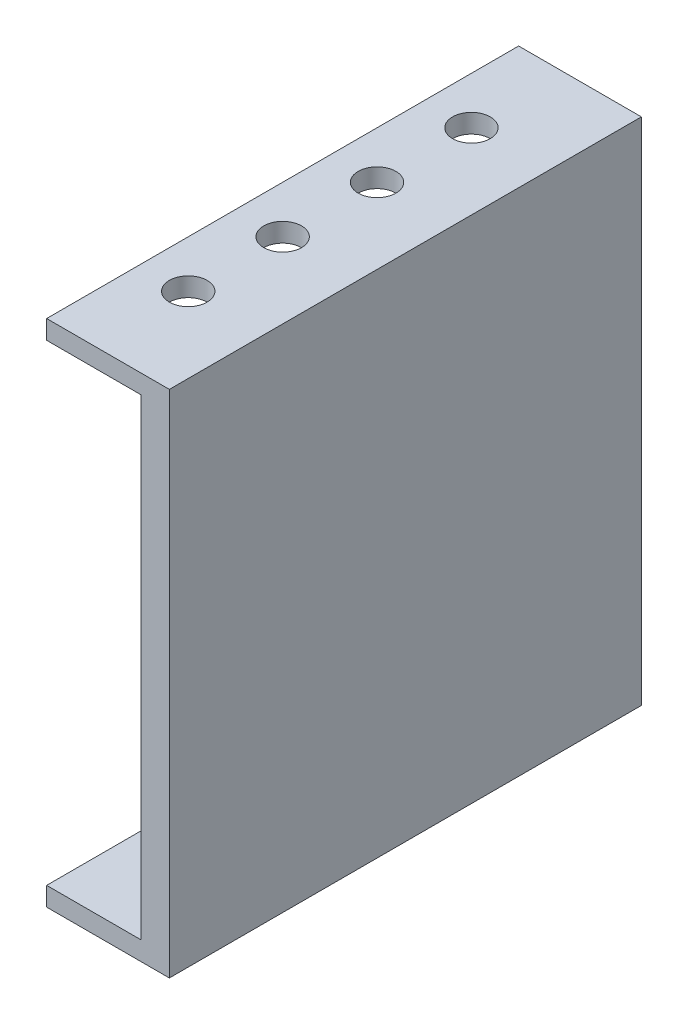
ISO-10303-21;
HEADER;
FILE_DESCRIPTION(('STEP AP214'),'2;1');
FILE_NAME('part.step','',(''),(''),'','','');
FILE_SCHEMA(('AUTOMOTIVE_DESIGN { 1 0 10303 214 1 1 1 1 }'));
ENDSEC;
DATA;
#1=APPLICATION_CONTEXT('core data for automotive mechanical design processes');
#2=APPLICATION_PROTOCOL_DEFINITION('international standard','automotive_design',2000,#1);
#3=PRODUCT_CONTEXT('',#1,'mechanical');
#4=PRODUCT('Part','Part','',(#3));
#5=PRODUCT_RELATED_PRODUCT_CATEGORY('part','',(#4));
#6=PRODUCT_DEFINITION_FORMATION('','',#4);
#7=PRODUCT_DEFINITION_CONTEXT('part definition',#1,'design');
#8=PRODUCT_DEFINITION('design','',#6,#7);
#9=PRODUCT_DEFINITION_SHAPE('','',#8);
#10=(LENGTH_UNIT() NAMED_UNIT(*) SI_UNIT(.MILLI.,.METRE.));
#11=(NAMED_UNIT(*) PLANE_ANGLE_UNIT() SI_UNIT($,.RADIAN.));
#12=(NAMED_UNIT(*) SI_UNIT($,.STERADIAN.) SOLID_ANGLE_UNIT());
#13=UNCERTAINTY_MEASURE_WITH_UNIT(LENGTH_MEASURE(1.E-05),#10,'distance_accuracy_value','');
#14=(GEOMETRIC_REPRESENTATION_CONTEXT(3) GLOBAL_UNCERTAINTY_ASSIGNED_CONTEXT((#13)) GLOBAL_UNIT_ASSIGNED_CONTEXT((#10,
#11,#12)) REPRESENTATION_CONTEXT('',''));
#15=CARTESIAN_POINT('',(0.,0.,0.));
#16=DIRECTION('',(0.,0.,1.));
#17=DIRECTION('',(1.,0.,0.));
#18=AXIS2_PLACEMENT_3D('',#15,#16,#17);
#19=CARTESIAN_POINT('',(0.,0.,0.));
#20=DIRECTION('',(0.,1.,0.));
#21=DIRECTION('',(0.,0.,1.));
#22=AXIS2_PLACEMENT_3D('',#19,#20,#21);
#23=PLANE('',#22);
#24=CARTESIAN_POINT('',(1.5000000000001,0.,-15.));
#25=DIRECTION('',(0.,1.,0.));
#26=DIRECTION('',(0.,0.,1.));
#27=AXIS2_PLACEMENT_3D('',#24,#25,#26);
#28=CIRCLE('',#27,2.);
#29=CARTESIAN_POINT('',(1.5000000000001,0.,-13.));
#30=VERTEX_POINT('',#29);
#31=EDGE_CURVE('E142',#30,#30,#28,.T.);
#32=ORIENTED_EDGE('',*,*,#31,.T.);
#33=EDGE_LOOP('',(#32));
#34=FACE_BOUND('',#33,.T.);
#35=CARTESIAN_POINT('',(1.50000000000007,0.,-5.00000000000001));
#36=DIRECTION('',(0.,1.,0.));
#37=DIRECTION('',(0.,0.,1.));
#38=AXIS2_PLACEMENT_3D('',#35,#36,#37);
#39=CIRCLE('',#38,2.);
#40=CARTESIAN_POINT('',(1.50000000000007,0.,-3.00000000000001));
#41=VERTEX_POINT('',#40);
#42=EDGE_CURVE('E146',#41,#41,#39,.T.);
#43=ORIENTED_EDGE('',*,*,#42,.T.);
#44=EDGE_LOOP('',(#43));
#45=FACE_BOUND('',#44,.T.);
#46=CARTESIAN_POINT('',(1.50000000000003,0.,4.99999999999999));
#47=DIRECTION('',(0.,1.,0.));
#48=DIRECTION('',(0.,0.,1.));
#49=AXIS2_PLACEMENT_3D('',#46,#47,#48);
#50=CIRCLE('',#49,2.);
#51=CARTESIAN_POINT('',(1.50000000000003,0.,6.99999999999999));
#52=VERTEX_POINT('',#51);
#53=EDGE_CURVE('E149',#52,#52,#50,.T.);
#54=ORIENTED_EDGE('',*,*,#53,.T.);
#55=EDGE_LOOP('',(#54));
#56=FACE_BOUND('',#55,.T.);
#57=CARTESIAN_POINT('',(1.5,0.,15.));
#58=DIRECTION('',(0.,1.,0.));
#59=DIRECTION('',(0.,0.,1.));
#60=AXIS2_PLACEMENT_3D('',#57,#58,#59);
#61=CIRCLE('',#60,2.);
#62=CARTESIAN_POINT('',(1.5,0.,17.));
#63=VERTEX_POINT('',#62);
#64=EDGE_CURVE('E121',#63,#63,#61,.T.);
#65=ORIENTED_EDGE('',*,*,#64,.T.);
#66=EDGE_LOOP('',(#65));
#67=FACE_BOUND('',#66,.T.);
#68=DIRECTION('',(0.,0.,1.));
#69=VECTOR('',#68,1.);
#70=CARTESIAN_POINT('',(-3.49999999999999,0.,-25.));
#71=LINE('',#70,#69);
#72=CARTESIAN_POINT('',(-3.49999999999999,0.,-25.));
#73=VERTEX_POINT('',#72);
#74=CARTESIAN_POINT('',(-3.49999999999999,0.,25.));
#75=VERTEX_POINT('',#74);
#76=EDGE_CURVE('E206',#73,#75,#71,.T.);
#77=ORIENTED_EDGE('',*,*,#76,.F.);
#78=DIRECTION('',(-1.,0.,0.));
#79=VECTOR('',#78,1.);
#80=CARTESIAN_POINT('',(-5.,0.,-25.));
#81=LINE('',#80,#79);
#82=CARTESIAN_POINT('',(6.50000000000001,0.,-25.));
#83=VERTEX_POINT('',#82);
#84=EDGE_CURVE('E132',#83,#73,#81,.T.);
#85=ORIENTED_EDGE('',*,*,#84,.F.);
#86=DIRECTION('',(0.,0.,-1.));
#87=VECTOR('',#86,1.);
#88=CARTESIAN_POINT('',(6.50000000000001,0.,25.));
#89=LINE('',#88,#87);
#90=CARTESIAN_POINT('',(6.50000000000001,0.,25.));
#91=VERTEX_POINT('',#90);
#92=EDGE_CURVE('E195',#91,#83,#89,.T.);
#93=ORIENTED_EDGE('',*,*,#92,.F.);
#94=DIRECTION('',(1.,0.,0.));
#95=VECTOR('',#94,1.);
#96=CARTESIAN_POINT('',(-5.,0.,25.));
#97=LINE('',#96,#95);
#98=EDGE_CURVE('E134',#75,#91,#97,.T.);
#99=ORIENTED_EDGE('',*,*,#98,.F.);
#100=EDGE_LOOP('',(#77,#85,#93,#99));
#101=FACE_BOUND('',#100,.T.);
#102=ADVANCED_FACE('F34',(#34,#45,#56,#67,#101),#23,.F.);
#103=CARTESIAN_POINT('',(-5.,2.,-25.));
#104=DIRECTION('',(0.,0.,1.));
#105=DIRECTION('',(1.,0.,0.));
#106=AXIS2_PLACEMENT_3D('',#103,#104,#105);
#107=PLANE('',#106);
#108=DIRECTION('',(0.,-1.,0.));
#109=VECTOR('',#108,1.);
#110=CARTESIAN_POINT('',(-3.49999999999999,-50.,-25.));
#111=LINE('',#110,#109);
#112=CARTESIAN_POINT('',(-3.49999999999999,-50.,-25.));
#113=VERTEX_POINT('',#112);
#114=CARTESIAN_POINT('',(-3.49999999999999,-52.,-25.));
#115=VERTEX_POINT('',#114);
#116=EDGE_CURVE('E100',#113,#115,#111,.T.);
#117=ORIENTED_EDGE('',*,*,#116,.F.);
#118=DIRECTION('',(1.,0.,0.));
#119=VECTOR('',#118,1.);
#120=CARTESIAN_POINT('',(-4.99999999999999,-50.,-25.));
#121=LINE('',#120,#119);
#122=CARTESIAN_POINT('',(6.50000000000001,-50.,-25.));
#123=VERTEX_POINT('',#122);
#124=EDGE_CURVE('E110',#113,#123,#121,.T.);
#125=ORIENTED_EDGE('',*,*,#124,.T.);
#126=DIRECTION('',(0.,-1.,0.));
#127=VECTOR('',#126,1.);
#128=CARTESIAN_POINT('',(6.50000000000001,0.,-25.));
#129=LINE('',#128,#127);
#130=EDGE_CURVE('E202',#83,#123,#129,.T.);
#131=ORIENTED_EDGE('',*,*,#130,.F.);
#132=ORIENTED_EDGE('',*,*,#84,.T.);
#133=DIRECTION('',(0.,-1.,0.));
#134=VECTOR('',#133,1.);
#135=CARTESIAN_POINT('',(-3.49999999999999,2.,-25.));
#136=LINE('',#135,#134);
#137=CARTESIAN_POINT('',(-3.49999999999999,2.,-25.));
#138=VERTEX_POINT('',#137);
#139=EDGE_CURVE('E208',#138,#73,#136,.T.);
#140=ORIENTED_EDGE('',*,*,#139,.F.);
#141=DIRECTION('',(-1.,0.,0.));
#142=VECTOR('',#141,1.);
#143=CARTESIAN_POINT('',(-5.,2.,-25.));
#144=LINE('',#143,#142);
#145=CARTESIAN_POINT('',(9.5,2.,-25.));
#146=VERTEX_POINT('',#145);
#147=EDGE_CURVE('E43',#146,#138,#144,.T.);
#148=ORIENTED_EDGE('',*,*,#147,.F.);
#149=DIRECTION('',(0.,1.,0.));
#150=VECTOR('',#149,1.);
#151=CARTESIAN_POINT('',(9.5,-52.,-25.));
#152=LINE('',#151,#150);
#153=CARTESIAN_POINT('',(9.5,-52.,-25.));
#154=VERTEX_POINT('',#153);
#155=EDGE_CURVE('E164',#154,#146,#152,.T.);
#156=ORIENTED_EDGE('',*,*,#155,.F.);
#157=DIRECTION('',(1.,0.,0.));
#158=VECTOR('',#157,1.);
#159=CARTESIAN_POINT('',(8.,-52.,-25.));
#160=LINE('',#159,#158);
#161=EDGE_CURVE('E113',#115,#154,#160,.T.);
#162=ORIENTED_EDGE('',*,*,#161,.F.);
#163=EDGE_LOOP('',(#117,#125,#131,#132,#140,#148,#156,#162));
#164=FACE_BOUND('',#163,.T.);
#165=ADVANCED_FACE('F36',(#164),#107,.F.);
#166=CARTESIAN_POINT('',(-5.,2.,25.));
#167=DIRECTION('',(0.,0.,-1.));
#168=DIRECTION('',(-1.,0.,0.));
#169=AXIS2_PLACEMENT_3D('',#166,#167,#168);
#170=PLANE('',#169);
#171=DIRECTION('',(0.,1.,0.));
#172=VECTOR('',#171,1.);
#173=CARTESIAN_POINT('',(-3.49999999999999,-52.,25.));
#174=LINE('',#173,#172);
#175=CARTESIAN_POINT('',(-3.49999999999999,-52.,25.));
#176=VERTEX_POINT('',#175);
#177=CARTESIAN_POINT('',(-3.49999999999999,-50.,25.));
#178=VERTEX_POINT('',#177);
#179=EDGE_CURVE('E59',#176,#178,#174,.T.);
#180=ORIENTED_EDGE('',*,*,#179,.F.);
#181=DIRECTION('',(-1.,0.,0.));
#182=VECTOR('',#181,1.);
#183=CARTESIAN_POINT('',(5.00000000000001,-52.,25.));
#184=LINE('',#183,#182);
#185=CARTESIAN_POINT('',(9.5,-52.,25.));
#186=VERTEX_POINT('',#185);
#187=EDGE_CURVE('E129',#186,#176,#184,.T.);
#188=ORIENTED_EDGE('',*,*,#187,.F.);
#189=DIRECTION('',(0.,-1.,0.));
#190=VECTOR('',#189,1.);
#191=CARTESIAN_POINT('',(9.5,2.,25.));
#192=LINE('',#191,#190);
#193=CARTESIAN_POINT('',(9.5,2.,25.));
#194=VERTEX_POINT('',#193);
#195=EDGE_CURVE('E189',#194,#186,#192,.T.);
#196=ORIENTED_EDGE('',*,*,#195,.F.);
#197=DIRECTION('',(1.,0.,0.));
#198=VECTOR('',#197,1.);
#199=CARTESIAN_POINT('',(-5.,2.,25.));
#200=LINE('',#199,#198);
#201=CARTESIAN_POINT('',(-3.49999999999999,2.,25.));
#202=VERTEX_POINT('',#201);
#203=EDGE_CURVE('E11',#202,#194,#200,.T.);
#204=ORIENTED_EDGE('',*,*,#203,.F.);
#205=DIRECTION('',(0.,1.,0.));
#206=VECTOR('',#205,1.);
#207=CARTESIAN_POINT('',(-3.49999999999999,0.,25.));
#208=LINE('',#207,#206);
#209=EDGE_CURVE('E51',#75,#202,#208,.T.);
#210=ORIENTED_EDGE('',*,*,#209,.F.);
#211=ORIENTED_EDGE('',*,*,#98,.T.);
#212=DIRECTION('',(0.,1.,0.));
#213=VECTOR('',#212,1.);
#214=CARTESIAN_POINT('',(6.50000000000001,-50.,25.));
#215=LINE('',#214,#213);
#216=CARTESIAN_POINT('',(6.50000000000001,-50.,25.));
#217=VERTEX_POINT('',#216);
#218=EDGE_CURVE('E198',#217,#91,#215,.T.);
#219=ORIENTED_EDGE('',*,*,#218,.F.);
#220=DIRECTION('',(1.,0.,0.));
#221=VECTOR('',#220,1.);
#222=CARTESIAN_POINT('',(-4.99999999999999,-50.,25.));
#223=LINE('',#222,#221);
#224=EDGE_CURVE('E120',#178,#217,#223,.T.);
#225=ORIENTED_EDGE('',*,*,#224,.F.);
#226=EDGE_LOOP('',(#180,#188,#196,#204,#210,#211,#219,#225));
#227=FACE_BOUND('',#226,.T.);
#228=ADVANCED_FACE('F213',(#227),#170,.F.);
#229=CARTESIAN_POINT('',(0.,2.,0.));
#230=DIRECTION('',(0.,1.,0.));
#231=DIRECTION('',(0.,0.,1.));
#232=AXIS2_PLACEMENT_3D('',#229,#230,#231);
#233=PLANE('',#232);
#234=CARTESIAN_POINT('',(1.5,2.,15.));
#235=DIRECTION('',(0.,-1.,0.));
#236=DIRECTION('',(0.,0.,-1.));
#237=AXIS2_PLACEMENT_3D('',#234,#235,#236);
#238=CIRCLE('',#237,2.);
#239=CARTESIAN_POINT('',(1.5,2.,13.));
#240=VERTEX_POINT('',#239);
#241=EDGE_CURVE('E143',#240,#240,#238,.T.);
#242=ORIENTED_EDGE('',*,*,#241,.T.);
#243=EDGE_LOOP('',(#242));
#244=FACE_BOUND('',#243,.T.);
#245=CARTESIAN_POINT('',(1.50000000000003,2.,4.99999999999999));
#246=DIRECTION('',(0.,-1.,0.));
#247=DIRECTION('',(0.,0.,-1.));
#248=AXIS2_PLACEMENT_3D('',#245,#246,#247);
#249=CIRCLE('',#248,2.);
#250=CARTESIAN_POINT('',(1.50000000000003,2.,2.99999999999999));
#251=VERTEX_POINT('',#250);
#252=EDGE_CURVE('E176',#251,#251,#249,.T.);
#253=ORIENTED_EDGE('',*,*,#252,.T.);
#254=EDGE_LOOP('',(#253));
#255=FACE_BOUND('',#254,.T.);
#256=CARTESIAN_POINT('',(1.50000000000007,2.,-5.00000000000001));
#257=DIRECTION('',(0.,-1.,0.));
#258=DIRECTION('',(0.,0.,-1.));
#259=AXIS2_PLACEMENT_3D('',#256,#257,#258);
#260=CIRCLE('',#259,2.);
#261=CARTESIAN_POINT('',(1.50000000000007,2.,-7.00000000000001));
#262=VERTEX_POINT('',#261);
#263=EDGE_CURVE('E170',#262,#262,#260,.T.);
#264=ORIENTED_EDGE('',*,*,#263,.T.);
#265=EDGE_LOOP('',(#264));
#266=FACE_BOUND('',#265,.T.);
#267=CARTESIAN_POINT('',(1.5000000000001,2.,-15.));
#268=DIRECTION('',(0.,-1.,0.));
#269=DIRECTION('',(0.,0.,-1.));
#270=AXIS2_PLACEMENT_3D('',#267,#268,#269);
#271=CIRCLE('',#270,2.);
#272=CARTESIAN_POINT('',(1.5000000000001,2.,-17.));
#273=VERTEX_POINT('',#272);
#274=EDGE_CURVE('E163',#273,#273,#271,.T.);
#275=ORIENTED_EDGE('',*,*,#274,.T.);
#276=EDGE_LOOP('',(#275));
#277=FACE_BOUND('',#276,.T.);
#278=ORIENTED_EDGE('',*,*,#147,.T.);
#279=DIRECTION('',(0.,0.,-1.));
#280=VECTOR('',#279,1.);
#281=CARTESIAN_POINT('',(-3.49999999999999,2.,25.));
#282=LINE('',#281,#280);
#283=EDGE_CURVE('E105',#202,#138,#282,.T.);
#284=ORIENTED_EDGE('',*,*,#283,.F.);
#285=ORIENTED_EDGE('',*,*,#203,.T.);
#286=DIRECTION('',(0.,0.,1.));
#287=VECTOR('',#286,1.);
#288=CARTESIAN_POINT('',(9.5,2.,-25.));
#289=LINE('',#288,#287);
#290=EDGE_CURVE('E192',#146,#194,#289,.T.);
#291=ORIENTED_EDGE('',*,*,#290,.F.);
#292=EDGE_LOOP('',(#278,#284,#285,#291));
#293=FACE_BOUND('',#292,.T.);
#294=ADVANCED_FACE('F223',(#244,#255,#266,#277,#293),#233,.T.);
#295=CARTESIAN_POINT('',(0.,-52.,0.));
#296=DIRECTION('',(0.,1.,0.));
#297=DIRECTION('',(0.,0.,1.));
#298=AXIS2_PLACEMENT_3D('',#295,#296,#297);
#299=PLANE('',#298);
#300=CARTESIAN_POINT('',(1.5000000000001,-52.,-15.));
#301=DIRECTION('',(0.,-1.,0.));
#302=DIRECTION('',(0.,0.,-1.));
#303=AXIS2_PLACEMENT_3D('',#300,#301,#302);
#304=CIRCLE('',#303,2.);
#305=CARTESIAN_POINT('',(1.5000000000001,-52.,-17.));
#306=VERTEX_POINT('',#305);
#307=EDGE_CURVE('E160',#306,#306,#304,.T.);
#308=ORIENTED_EDGE('',*,*,#307,.F.);
#309=EDGE_LOOP('',(#308));
#310=FACE_BOUND('',#309,.T.);
#311=CARTESIAN_POINT('',(1.50000000000007,-52.,-5.00000000000001));
#312=DIRECTION('',(0.,-1.,0.));
#313=DIRECTION('',(0.,0.,-1.));
#314=AXIS2_PLACEMENT_3D('',#311,#312,#313);
#315=CIRCLE('',#314,2.);
#316=CARTESIAN_POINT('',(1.50000000000007,-52.,-7.00000000000001));
#317=VERTEX_POINT('',#316);
#318=EDGE_CURVE('E167',#317,#317,#315,.T.);
#319=ORIENTED_EDGE('',*,*,#318,.F.);
#320=EDGE_LOOP('',(#319));
#321=FACE_BOUND('',#320,.T.);
#322=CARTESIAN_POINT('',(1.50000000000003,-52.,4.99999999999999));
#323=DIRECTION('',(0.,-1.,0.));
#324=DIRECTION('',(0.,0.,-1.));
#325=AXIS2_PLACEMENT_3D('',#322,#323,#324);
#326=CIRCLE('',#325,2.);
#327=CARTESIAN_POINT('',(1.50000000000003,-52.,2.99999999999999));
#328=VERTEX_POINT('',#327);
#329=EDGE_CURVE('E173',#328,#328,#326,.T.);
#330=ORIENTED_EDGE('',*,*,#329,.F.);
#331=EDGE_LOOP('',(#330));
#332=FACE_BOUND('',#331,.T.);
#333=CARTESIAN_POINT('',(1.5,-52.,15.));
#334=DIRECTION('',(0.,-1.,0.));
#335=DIRECTION('',(0.,0.,-1.));
#336=AXIS2_PLACEMENT_3D('',#333,#334,#335);
#337=CIRCLE('',#336,2.);
#338=CARTESIAN_POINT('',(1.5,-52.,13.));
#339=VERTEX_POINT('',#338);
#340=EDGE_CURVE('E179',#339,#339,#337,.T.);
#341=ORIENTED_EDGE('',*,*,#340,.F.);
#342=EDGE_LOOP('',(#341));
#343=FACE_BOUND('',#342,.T.);
#344=DIRECTION('',(0.,0.,1.));
#345=VECTOR('',#344,1.);
#346=CARTESIAN_POINT('',(-3.49999999999999,-52.,-25.));
#347=LINE('',#346,#345);
#348=EDGE_CURVE('E114',#115,#176,#347,.T.);
#349=ORIENTED_EDGE('',*,*,#348,.F.);
#350=ORIENTED_EDGE('',*,*,#161,.T.);
#351=DIRECTION('',(0.,0.,-1.));
#352=VECTOR('',#351,1.);
#353=CARTESIAN_POINT('',(9.5,-52.,25.));
#354=LINE('',#353,#352);
#355=EDGE_CURVE('E186',#186,#154,#354,.T.);
#356=ORIENTED_EDGE('',*,*,#355,.F.);
#357=ORIENTED_EDGE('',*,*,#187,.T.);
#358=EDGE_LOOP('',(#349,#350,#356,#357));
#359=FACE_BOUND('',#358,.T.);
#360=ADVANCED_FACE('F217',(#310,#321,#332,#343,#359),#299,.F.);
#361=CARTESIAN_POINT('',(-4.99999999999999,-50.,-25.));
#362=DIRECTION('',(0.,-1.,0.));
#363=DIRECTION('',(0.,0.,-1.));
#364=AXIS2_PLACEMENT_3D('',#361,#362,#363);
#365=PLANE('',#364);
#366=CARTESIAN_POINT('',(1.5000000000001,-50.,-15.));
#367=DIRECTION('',(0.,-1.,0.));
#368=DIRECTION('',(0.,0.,-1.));
#369=AXIS2_PLACEMENT_3D('',#366,#367,#368);
#370=CIRCLE('',#369,2.);
#371=CARTESIAN_POINT('',(1.5000000000001,-50.,-17.));
#372=VERTEX_POINT('',#371);
#373=EDGE_CURVE('E139',#372,#372,#370,.T.);
#374=ORIENTED_EDGE('',*,*,#373,.T.);
#375=EDGE_LOOP('',(#374));
#376=FACE_BOUND('',#375,.T.);
#377=CARTESIAN_POINT('',(1.50000000000007,-50.,-5.00000000000001));
#378=DIRECTION('',(0.,-1.,0.));
#379=DIRECTION('',(0.,0.,-1.));
#380=AXIS2_PLACEMENT_3D('',#377,#378,#379);
#381=CIRCLE('',#380,2.);
#382=CARTESIAN_POINT('',(1.50000000000007,-50.,-7.00000000000001));
#383=VERTEX_POINT('',#382);
#384=EDGE_CURVE('E144',#383,#383,#381,.T.);
#385=ORIENTED_EDGE('',*,*,#384,.T.);
#386=EDGE_LOOP('',(#385));
#387=FACE_BOUND('',#386,.T.);
#388=CARTESIAN_POINT('',(1.50000000000003,-50.,4.99999999999999));
#389=DIRECTION('',(0.,-1.,0.));
#390=DIRECTION('',(0.,0.,-1.));
#391=AXIS2_PLACEMENT_3D('',#388,#389,#390);
#392=CIRCLE('',#391,2.);
#393=CARTESIAN_POINT('',(1.50000000000003,-50.,2.99999999999999));
#394=VERTEX_POINT('',#393);
#395=EDGE_CURVE('E147',#394,#394,#392,.T.);
#396=ORIENTED_EDGE('',*,*,#395,.T.);
#397=EDGE_LOOP('',(#396));
#398=FACE_BOUND('',#397,.T.);
#399=CARTESIAN_POINT('',(1.5,-50.,15.));
#400=DIRECTION('',(0.,-1.,0.));
#401=DIRECTION('',(0.,0.,-1.));
#402=AXIS2_PLACEMENT_3D('',#399,#400,#401);
#403=CIRCLE('',#402,2.);
#404=CARTESIAN_POINT('',(1.5,-50.,13.));
#405=VERTEX_POINT('',#404);
#406=EDGE_CURVE('E38',#405,#405,#403,.T.);
#407=ORIENTED_EDGE('',*,*,#406,.T.);
#408=EDGE_LOOP('',(#407));
#409=FACE_BOUND('',#408,.T.);
#410=DIRECTION('',(0.,0.,-1.));
#411=VECTOR('',#410,1.);
#412=CARTESIAN_POINT('',(-3.49999999999999,-50.,25.));
#413=LINE('',#412,#411);
#414=EDGE_CURVE('E97',#178,#113,#413,.T.);
#415=ORIENTED_EDGE('',*,*,#414,.F.);
#416=ORIENTED_EDGE('',*,*,#224,.T.);
#417=DIRECTION('',(0.,0.,1.));
#418=VECTOR('',#417,1.);
#419=CARTESIAN_POINT('',(6.50000000000001,-50.,-25.));
#420=LINE('',#419,#418);
#421=EDGE_CURVE('E118',#123,#217,#420,.T.);
#422=ORIENTED_EDGE('',*,*,#421,.F.);
#423=ORIENTED_EDGE('',*,*,#124,.F.);
#424=EDGE_LOOP('',(#415,#416,#422,#423));
#425=FACE_BOUND('',#424,.T.);
#426=ADVANCED_FACE('F116',(#376,#387,#398,#409,#425),#365,.F.);
#427=CARTESIAN_POINT('',(1.5000000000001,2.,-15.));
#428=DIRECTION('',(0.,-1.,0.));
#429=DIRECTION('',(0.,0.,-1.));
#430=AXIS2_PLACEMENT_3D('',#427,#428,#429);
#431=CYLINDRICAL_SURFACE('',#430,2.);
#432=ORIENTED_EDGE('',*,*,#307,.T.);
#433=EDGE_LOOP('',(#432));
#434=FACE_BOUND('',#433,.T.);
#435=ORIENTED_EDGE('',*,*,#373,.F.);
#436=EDGE_LOOP('',(#435));
#437=FACE_BOUND('',#436,.T.);
#438=ADVANCED_FACE('F273',(#434,#437),#431,.F.);
#439=CARTESIAN_POINT('',(1.50000000000007,2.,-5.00000000000001));
#440=DIRECTION('',(0.,-1.,0.));
#441=DIRECTION('',(0.,0.,-1.));
#442=AXIS2_PLACEMENT_3D('',#439,#440,#441);
#443=CYLINDRICAL_SURFACE('',#442,2.);
#444=ORIENTED_EDGE('',*,*,#318,.T.);
#445=EDGE_LOOP('',(#444));
#446=FACE_BOUND('',#445,.T.);
#447=ORIENTED_EDGE('',*,*,#384,.F.);
#448=EDGE_LOOP('',(#447));
#449=FACE_BOUND('',#448,.T.);
#450=ADVANCED_FACE('F282',(#446,#449),#443,.F.);
#451=CARTESIAN_POINT('',(1.50000000000003,2.,4.99999999999999));
#452=DIRECTION('',(0.,-1.,0.));
#453=DIRECTION('',(0.,0.,-1.));
#454=AXIS2_PLACEMENT_3D('',#451,#452,#453);
#455=CYLINDRICAL_SURFACE('',#454,2.);
#456=ORIENTED_EDGE('',*,*,#329,.T.);
#457=EDGE_LOOP('',(#456));
#458=FACE_BOUND('',#457,.T.);
#459=ORIENTED_EDGE('',*,*,#395,.F.);
#460=EDGE_LOOP('',(#459));
#461=FACE_BOUND('',#460,.T.);
#462=ADVANCED_FACE('F283',(#458,#461),#455,.F.);
#463=CARTESIAN_POINT('',(1.5,2.,15.));
#464=DIRECTION('',(0.,-1.,0.));
#465=DIRECTION('',(0.,0.,-1.));
#466=AXIS2_PLACEMENT_3D('',#463,#464,#465);
#467=CYLINDRICAL_SURFACE('',#466,2.);
#468=ORIENTED_EDGE('',*,*,#340,.T.);
#469=EDGE_LOOP('',(#468));
#470=FACE_BOUND('',#469,.T.);
#471=ORIENTED_EDGE('',*,*,#406,.F.);
#472=EDGE_LOOP('',(#471));
#473=FACE_BOUND('',#472,.T.);
#474=ADVANCED_FACE('F271',(#470,#473),#467,.F.);
#475=ORIENTED_EDGE('',*,*,#274,.F.);
#476=EDGE_LOOP('',(#475));
#477=FACE_BOUND('',#476,.T.);
#478=ORIENTED_EDGE('',*,*,#31,.F.);
#479=EDGE_LOOP('',(#478));
#480=FACE_BOUND('',#479,.T.);
#481=ADVANCED_FACE('F267',(#477,#480),#431,.F.);
#482=ORIENTED_EDGE('',*,*,#263,.F.);
#483=EDGE_LOOP('',(#482));
#484=FACE_BOUND('',#483,.T.);
#485=ORIENTED_EDGE('',*,*,#42,.F.);
#486=EDGE_LOOP('',(#485));
#487=FACE_BOUND('',#486,.T.);
#488=ADVANCED_FACE('F270',(#484,#487),#443,.F.);
#489=ORIENTED_EDGE('',*,*,#252,.F.);
#490=EDGE_LOOP('',(#489));
#491=FACE_BOUND('',#490,.T.);
#492=ORIENTED_EDGE('',*,*,#53,.F.);
#493=EDGE_LOOP('',(#492));
#494=FACE_BOUND('',#493,.T.);
#495=ADVANCED_FACE('F279',(#491,#494),#455,.F.);
#496=ORIENTED_EDGE('',*,*,#241,.F.);
#497=EDGE_LOOP('',(#496));
#498=FACE_BOUND('',#497,.T.);
#499=ORIENTED_EDGE('',*,*,#64,.F.);
#500=EDGE_LOOP('',(#499));
#501=FACE_BOUND('',#500,.T.);
#502=ADVANCED_FACE('F239',(#498,#501),#467,.F.);
#503=CARTESIAN_POINT('',(9.5,0.,0.));
#504=DIRECTION('',(1.,0.,0.));
#505=DIRECTION('',(0.,0.,-1.));
#506=AXIS2_PLACEMENT_3D('',#503,#504,#505);
#507=PLANE('',#506);
#508=ORIENTED_EDGE('',*,*,#290,.T.);
#509=ORIENTED_EDGE('',*,*,#195,.T.);
#510=ORIENTED_EDGE('',*,*,#355,.T.);
#511=ORIENTED_EDGE('',*,*,#155,.T.);
#512=EDGE_LOOP('',(#508,#509,#510,#511));
#513=FACE_BOUND('',#512,.T.);
#514=ADVANCED_FACE('F219',(#513),#507,.T.);
#515=CARTESIAN_POINT('',(6.50000000000001,0.,0.));
#516=DIRECTION('',(-1.,0.,0.));
#517=DIRECTION('',(0.,0.,1.));
#518=AXIS2_PLACEMENT_3D('',#515,#516,#517);
#519=PLANE('',#518);
#520=ORIENTED_EDGE('',*,*,#130,.T.);
#521=ORIENTED_EDGE('',*,*,#421,.T.);
#522=ORIENTED_EDGE('',*,*,#218,.T.);
#523=ORIENTED_EDGE('',*,*,#92,.T.);
#524=EDGE_LOOP('',(#520,#521,#522,#523));
#525=FACE_BOUND('',#524,.T.);
#526=ADVANCED_FACE('F230',(#525),#519,.T.);
#527=CARTESIAN_POINT('',(-3.49999999999999,0.,0.));
#528=DIRECTION('',(-1.,0.,0.));
#529=DIRECTION('',(0.,0.,1.));
#530=AXIS2_PLACEMENT_3D('',#527,#528,#529);
#531=PLANE('',#530);
#532=ORIENTED_EDGE('',*,*,#414,.T.);
#533=ORIENTED_EDGE('',*,*,#116,.T.);
#534=ORIENTED_EDGE('',*,*,#348,.T.);
#535=ORIENTED_EDGE('',*,*,#179,.T.);
#536=EDGE_LOOP('',(#532,#533,#534,#535));
#537=FACE_BOUND('',#536,.T.);
#538=ADVANCED_FACE('F99',(#537),#531,.T.);
#539=CARTESIAN_POINT('',(-3.49999999999999,0.,0.));
#540=DIRECTION('',(-1.,0.,0.));
#541=DIRECTION('',(0.,0.,1.));
#542=AXIS2_PLACEMENT_3D('',#539,#540,#541);
#543=PLANE('',#542);
#544=ORIENTED_EDGE('',*,*,#139,.T.);
#545=ORIENTED_EDGE('',*,*,#76,.T.);
#546=ORIENTED_EDGE('',*,*,#209,.T.);
#547=ORIENTED_EDGE('',*,*,#283,.T.);
#548=EDGE_LOOP('',(#544,#545,#546,#547));
#549=FACE_BOUND('',#548,.T.);
#550=ADVANCED_FACE('F237',(#549),#543,.T.);
#551=CLOSED_SHELL('',(#102,#165,#228,#294,#360,#426,#438,#450,#462,#474,#481,#488,#495,#502,
#514,#526,#538,#550));
#552=MANIFOLD_SOLID_BREP('B2',#551);
#553=ADVANCED_BREP_SHAPE_REPRESENTATION('',(#18,#552),#14);
#554=SHAPE_DEFINITION_REPRESENTATION(#9,#553);
ENDSEC;
END-ISO-10303-21;
